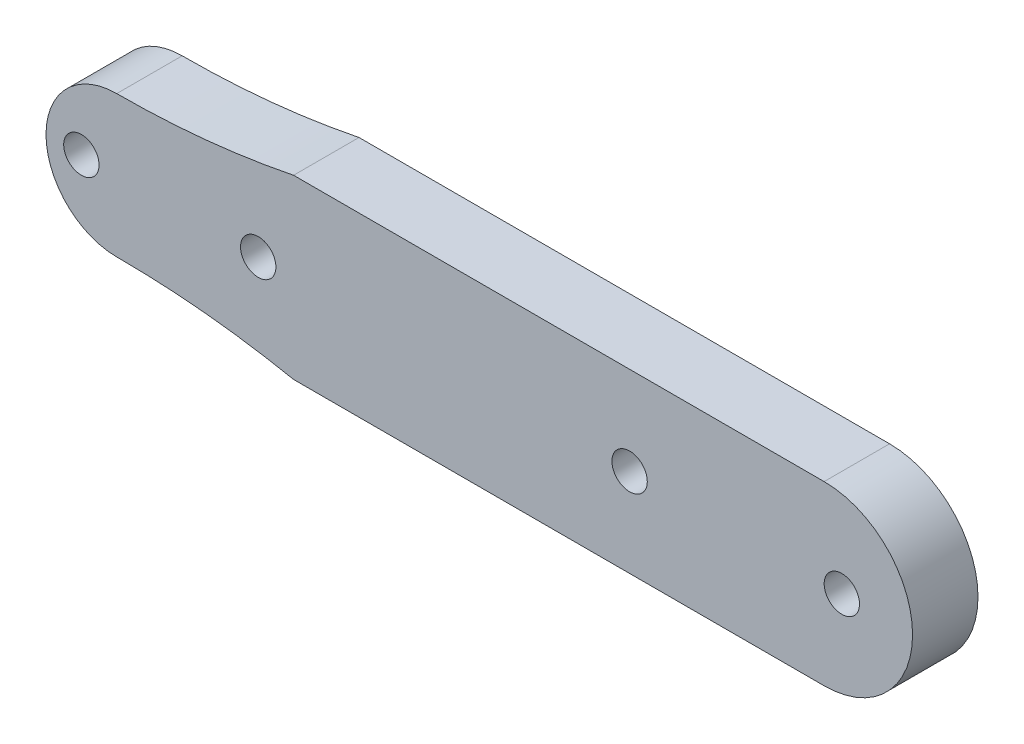
ISO-10303-21;
HEADER;
FILE_DESCRIPTION(('STEP AP214'),'2;1');
FILE_NAME('part.step','',(''),(''),'','','');
FILE_SCHEMA(('AUTOMOTIVE_DESIGN { 1 0 10303 214 1 1 1 1 }'));
ENDSEC;
DATA;
#1=APPLICATION_CONTEXT('core data for automotive mechanical design processes');
#2=APPLICATION_PROTOCOL_DEFINITION('international standard','automotive_design',2000,#1);
#3=PRODUCT_CONTEXT('',#1,'mechanical');
#4=PRODUCT('Part','Part','',(#3));
#5=PRODUCT_RELATED_PRODUCT_CATEGORY('part','',(#4));
#6=PRODUCT_DEFINITION_FORMATION('','',#4);
#7=PRODUCT_DEFINITION_CONTEXT('part definition',#1,'design');
#8=PRODUCT_DEFINITION('design','',#6,#7);
#9=PRODUCT_DEFINITION_SHAPE('','',#8);
#10=(LENGTH_UNIT() NAMED_UNIT(*) SI_UNIT(.MILLI.,.METRE.));
#11=(NAMED_UNIT(*) PLANE_ANGLE_UNIT() SI_UNIT($,.RADIAN.));
#12=(NAMED_UNIT(*) SI_UNIT($,.STERADIAN.) SOLID_ANGLE_UNIT());
#13=UNCERTAINTY_MEASURE_WITH_UNIT(LENGTH_MEASURE(1.E-05),#10,'distance_accuracy_value','');
#14=(GEOMETRIC_REPRESENTATION_CONTEXT(3) GLOBAL_UNCERTAINTY_ASSIGNED_CONTEXT((#13)) GLOBAL_UNIT_ASSIGNED_CONTEXT((#10,
#11,#12)) REPRESENTATION_CONTEXT('',''));
#15=CARTESIAN_POINT('',(0.,0.,0.));
#16=DIRECTION('',(0.,0.,1.));
#17=DIRECTION('',(1.,0.,0.));
#18=AXIS2_PLACEMENT_3D('',#15,#16,#17);
#19=CARTESIAN_POINT('',(-10.,54.5,3.7));
#20=DIRECTION('',(0.,0.,1.));
#21=DIRECTION('',(1.,0.,0.));
#22=AXIS2_PLACEMENT_3D('',#19,#20,#21);
#23=PLANE('',#22);
#24=CARTESIAN_POINT('',(19.,0.,3.7));
#25=DIRECTION('',(0.,0.,1.));
#26=DIRECTION('',(1.,0.,0.));
#27=AXIS2_PLACEMENT_3D('',#24,#25,#26);
#28=CIRCLE('',#27,1.);
#29=CARTESIAN_POINT('',(20.,0.,3.7));
#30=VERTEX_POINT('',#29);
#31=EDGE_CURVE('E188',#30,#30,#28,.T.);
#32=ORIENTED_EDGE('',*,*,#31,.F.);
#33=EDGE_LOOP('',(#32));
#34=FACE_BOUND('',#33,.T.);
#35=CARTESIAN_POINT('',(-12.,0.,3.7));
#36=DIRECTION('',(0.,0.,1.));
#37=DIRECTION('',(1.,0.,0.));
#38=AXIS2_PLACEMENT_3D('',#35,#36,#37);
#39=CIRCLE('',#38,1.);
#40=CARTESIAN_POINT('',(-11.,0.,3.7));
#41=VERTEX_POINT('',#40);
#42=EDGE_CURVE('E121',#41,#41,#39,.T.);
#43=ORIENTED_EDGE('',*,*,#42,.F.);
#44=EDGE_LOOP('',(#43));
#45=FACE_BOUND('',#44,.T.);
#46=CARTESIAN_POINT('',(-10.,54.5,3.7));
#47=DIRECTION('',(0.,0.,-1.));
#48=DIRECTION('',(1.,0.,0.));
#49=AXIS2_PLACEMENT_3D('',#46,#47,#48);
#50=CIRCLE('',#49,50.5);
#51=CARTESIAN_POINT('',(0.,5.,3.7));
#52=VERTEX_POINT('',#51);
#53=CARTESIAN_POINT('',(-10.,4.,3.7));
#54=VERTEX_POINT('',#53);
#55=EDGE_CURVE('E128',#52,#54,#50,.T.);
#56=ORIENTED_EDGE('',*,*,#55,.T.);
#57=CARTESIAN_POINT('',(-10.,0.,3.7));
#58=DIRECTION('',(0.,0.,1.));
#59=DIRECTION('',(1.,0.,0.));
#60=AXIS2_PLACEMENT_3D('',#57,#58,#59);
#61=CIRCLE('',#60,4.);
#62=CARTESIAN_POINT('',(-10.,-4.,3.7));
#63=VERTEX_POINT('',#62);
#64=EDGE_CURVE('E86',#54,#63,#61,.T.);
#65=ORIENTED_EDGE('',*,*,#64,.T.);
#66=CARTESIAN_POINT('',(-9.99999999999999,-54.5,3.7));
#67=DIRECTION('',(0.,0.,-1.));
#68=DIRECTION('',(-1.,0.,0.));
#69=AXIS2_PLACEMENT_3D('',#66,#67,#68);
#70=CIRCLE('',#69,50.5);
#71=CARTESIAN_POINT('',(0.,-5.,3.7));
#72=VERTEX_POINT('',#71);
#73=EDGE_CURVE('E99',#63,#72,#70,.T.);
#74=ORIENTED_EDGE('',*,*,#73,.T.);
#75=DIRECTION('',(1.,0.,0.));
#76=VECTOR('',#75,1.);
#77=CARTESIAN_POINT('',(0.,-5.,3.7));
#78=LINE('',#77,#76);
#79=CARTESIAN_POINT('',(30.0000000000001,-5.,3.7));
#80=VERTEX_POINT('',#79);
#81=EDGE_CURVE('E93',#72,#80,#78,.T.);
#82=ORIENTED_EDGE('',*,*,#81,.T.);
#83=CARTESIAN_POINT('',(30.,0.,3.7));
#84=DIRECTION('',(0.,0.,1.));
#85=DIRECTION('',(1.,0.,0.));
#86=AXIS2_PLACEMENT_3D('',#83,#84,#85);
#87=CIRCLE('',#86,5.);
#88=CARTESIAN_POINT('',(30.,5.00000000000011,3.7));
#89=VERTEX_POINT('',#88);
#90=EDGE_CURVE('E97',#80,#89,#87,.T.);
#91=ORIENTED_EDGE('',*,*,#90,.T.);
#92=DIRECTION('',(-1.,0.,0.));
#93=VECTOR('',#92,1.);
#94=CARTESIAN_POINT('',(0.,5.,3.7));
#95=LINE('',#94,#93);
#96=EDGE_CURVE('E49',#89,#52,#95,.T.);
#97=ORIENTED_EDGE('',*,*,#96,.T.);
#98=EDGE_LOOP('',(#56,#65,#74,#82,#91,#97));
#99=FACE_BOUND('',#98,.T.);
#100=CARTESIAN_POINT('',(-2.,0.,3.7));
#101=DIRECTION('',(0.,0.,1.));
#102=DIRECTION('',(1.,0.,0.));
#103=AXIS2_PLACEMENT_3D('',#100,#101,#102);
#104=CIRCLE('',#103,1.);
#105=CARTESIAN_POINT('',(-1.,0.,3.7));
#106=VERTEX_POINT('',#105);
#107=EDGE_CURVE('E194',#106,#106,#104,.T.);
#108=ORIENTED_EDGE('',*,*,#107,.F.);
#109=EDGE_LOOP('',(#108));
#110=FACE_BOUND('',#109,.T.);
#111=CARTESIAN_POINT('',(31.,0.,3.7));
#112=DIRECTION('',(0.,0.,1.));
#113=DIRECTION('',(1.,0.,0.));
#114=AXIS2_PLACEMENT_3D('',#111,#112,#113);
#115=CIRCLE('',#114,0.999999999999995);
#116=CARTESIAN_POINT('',(32.,0.,3.7));
#117=VERTEX_POINT('',#116);
#118=EDGE_CURVE('E179',#117,#117,#115,.T.);
#119=ORIENTED_EDGE('',*,*,#118,.F.);
#120=EDGE_LOOP('',(#119));
#121=FACE_BOUND('',#120,.T.);
#122=ADVANCED_FACE('F32',(#34,#45,#99,#110,#121),#23,.T.);
#123=CARTESIAN_POINT('',(-10.,54.5,0.));
#124=DIRECTION('',(0.,0.,1.));
#125=DIRECTION('',(1.,0.,0.));
#126=AXIS2_PLACEMENT_3D('',#123,#124,#125);
#127=PLANE('',#126);
#128=CARTESIAN_POINT('',(-10.,54.5,0.));
#129=DIRECTION('',(0.,0.,-1.));
#130=DIRECTION('',(1.,0.,0.));
#131=AXIS2_PLACEMENT_3D('',#128,#129,#130);
#132=CIRCLE('',#131,50.5);
#133=CARTESIAN_POINT('',(0.,5.,0.));
#134=VERTEX_POINT('',#133);
#135=CARTESIAN_POINT('',(-10.,4.,0.));
#136=VERTEX_POINT('',#135);
#137=EDGE_CURVE('E117',#134,#136,#132,.T.);
#138=ORIENTED_EDGE('',*,*,#137,.F.);
#139=DIRECTION('',(-1.,0.,0.));
#140=VECTOR('',#139,1.);
#141=CARTESIAN_POINT('',(0.,5.,0.));
#142=LINE('',#141,#140);
#143=CARTESIAN_POINT('',(30.,5.00000000000011,0.));
#144=VERTEX_POINT('',#143);
#145=EDGE_CURVE('E78',#144,#134,#142,.T.);
#146=ORIENTED_EDGE('',*,*,#145,.F.);
#147=CARTESIAN_POINT('',(30.,0.,0.));
#148=DIRECTION('',(0.,0.,1.));
#149=DIRECTION('',(1.,0.,0.));
#150=AXIS2_PLACEMENT_3D('',#147,#148,#149);
#151=CIRCLE('',#150,5.);
#152=CARTESIAN_POINT('',(30.0000000000001,-5.,0.));
#153=VERTEX_POINT('',#152);
#154=EDGE_CURVE('E72',#153,#144,#151,.T.);
#155=ORIENTED_EDGE('',*,*,#154,.F.);
#156=DIRECTION('',(1.,0.,0.));
#157=VECTOR('',#156,1.);
#158=CARTESIAN_POINT('',(0.,-5.,0.));
#159=LINE('',#158,#157);
#160=CARTESIAN_POINT('',(0.,-5.,0.));
#161=VERTEX_POINT('',#160);
#162=EDGE_CURVE('E107',#161,#153,#159,.T.);
#163=ORIENTED_EDGE('',*,*,#162,.F.);
#164=CARTESIAN_POINT('',(-9.99999999999999,-54.5,0.));
#165=DIRECTION('',(0.,0.,-1.));
#166=DIRECTION('',(-1.,0.,0.));
#167=AXIS2_PLACEMENT_3D('',#164,#165,#166);
#168=CIRCLE('',#167,50.5);
#169=CARTESIAN_POINT('',(-10.,-4.,0.));
#170=VERTEX_POINT('',#169);
#171=EDGE_CURVE('E123',#170,#161,#168,.T.);
#172=ORIENTED_EDGE('',*,*,#171,.F.);
#173=CARTESIAN_POINT('',(-10.,0.,0.));
#174=DIRECTION('',(0.,0.,1.));
#175=DIRECTION('',(1.,0.,0.));
#176=AXIS2_PLACEMENT_3D('',#173,#174,#175);
#177=CIRCLE('',#176,4.);
#178=EDGE_CURVE('E120',#136,#170,#177,.T.);
#179=ORIENTED_EDGE('',*,*,#178,.F.);
#180=EDGE_LOOP('',(#138,#146,#155,#163,#172,#179));
#181=FACE_BOUND('',#180,.T.);
#182=CARTESIAN_POINT('',(-12.,0.,0.));
#183=DIRECTION('',(0.,0.,1.));
#184=DIRECTION('',(1.,0.,0.));
#185=AXIS2_PLACEMENT_3D('',#182,#183,#184);
#186=CIRCLE('',#185,1.);
#187=CARTESIAN_POINT('',(-11.,0.,0.));
#188=VERTEX_POINT('',#187);
#189=EDGE_CURVE('E197',#188,#188,#186,.T.);
#190=ORIENTED_EDGE('',*,*,#189,.T.);
#191=EDGE_LOOP('',(#190));
#192=FACE_BOUND('',#191,.T.);
#193=CARTESIAN_POINT('',(-2.,0.,0.));
#194=DIRECTION('',(0.,0.,1.));
#195=DIRECTION('',(1.,0.,0.));
#196=AXIS2_PLACEMENT_3D('',#193,#194,#195);
#197=CIRCLE('',#196,1.);
#198=CARTESIAN_POINT('',(-1.,0.,0.));
#199=VERTEX_POINT('',#198);
#200=EDGE_CURVE('E191',#199,#199,#197,.T.);
#201=ORIENTED_EDGE('',*,*,#200,.T.);
#202=EDGE_LOOP('',(#201));
#203=FACE_BOUND('',#202,.T.);
#204=CARTESIAN_POINT('',(19.,0.,0.));
#205=DIRECTION('',(0.,0.,1.));
#206=DIRECTION('',(1.,0.,0.));
#207=AXIS2_PLACEMENT_3D('',#204,#205,#206);
#208=CIRCLE('',#207,1.);
#209=CARTESIAN_POINT('',(20.,0.,0.));
#210=VERTEX_POINT('',#209);
#211=EDGE_CURVE('E185',#210,#210,#208,.T.);
#212=ORIENTED_EDGE('',*,*,#211,.T.);
#213=EDGE_LOOP('',(#212));
#214=FACE_BOUND('',#213,.T.);
#215=CARTESIAN_POINT('',(31.,0.,0.));
#216=DIRECTION('',(0.,0.,1.));
#217=DIRECTION('',(1.,0.,0.));
#218=AXIS2_PLACEMENT_3D('',#215,#216,#217);
#219=CIRCLE('',#218,0.999999999999995);
#220=CARTESIAN_POINT('',(32.,0.,0.));
#221=VERTEX_POINT('',#220);
#222=EDGE_CURVE('E182',#221,#221,#219,.T.);
#223=ORIENTED_EDGE('',*,*,#222,.T.);
#224=EDGE_LOOP('',(#223));
#225=FACE_BOUND('',#224,.T.);
#226=ADVANCED_FACE('F137',(#181,#192,#203,#214,#225),#127,.F.);
#227=CARTESIAN_POINT('',(-10.,54.5,3.7));
#228=DIRECTION('',(0.,0.,-1.));
#229=DIRECTION('',(-1.,0.,0.));
#230=AXIS2_PLACEMENT_3D('',#227,#228,#229);
#231=CYLINDRICAL_SURFACE('',#230,50.5);
#232=ORIENTED_EDGE('',*,*,#137,.T.);
#233=DIRECTION('',(0.,0.,-1.));
#234=VECTOR('',#233,1.);
#235=CARTESIAN_POINT('',(-10.,4.,3.7));
#236=LINE('',#235,#234);
#237=EDGE_CURVE('E11',#54,#136,#236,.T.);
#238=ORIENTED_EDGE('',*,*,#237,.F.);
#239=ORIENTED_EDGE('',*,*,#55,.F.);
#240=DIRECTION('',(0.,0.,-1.));
#241=VECTOR('',#240,1.);
#242=CARTESIAN_POINT('',(0.,5.,3.7));
#243=LINE('',#242,#241);
#244=EDGE_CURVE('E113',#52,#134,#243,.T.);
#245=ORIENTED_EDGE('',*,*,#244,.T.);
#246=EDGE_LOOP('',(#232,#238,#239,#245));
#247=FACE_BOUND('',#246,.T.);
#248=ADVANCED_FACE('F34',(#247),#231,.F.);
#249=CARTESIAN_POINT('',(-10.,0.,3.7));
#250=DIRECTION('',(0.,0.,-1.));
#251=DIRECTION('',(-1.,0.,0.));
#252=AXIS2_PLACEMENT_3D('',#249,#250,#251);
#253=CYLINDRICAL_SURFACE('',#252,4.);
#254=ORIENTED_EDGE('',*,*,#178,.T.);
#255=DIRECTION('',(0.,0.,-1.));
#256=VECTOR('',#255,1.);
#257=CARTESIAN_POINT('',(-10.,-4.,3.7));
#258=LINE('',#257,#256);
#259=EDGE_CURVE('E41',#63,#170,#258,.T.);
#260=ORIENTED_EDGE('',*,*,#259,.F.);
#261=ORIENTED_EDGE('',*,*,#64,.F.);
#262=ORIENTED_EDGE('',*,*,#237,.T.);
#263=EDGE_LOOP('',(#254,#260,#261,#262));
#264=FACE_BOUND('',#263,.T.);
#265=ADVANCED_FACE('F255',(#264),#253,.T.);
#266=CARTESIAN_POINT('',(-9.99999999999999,-54.5,3.7));
#267=DIRECTION('',(0.,0.,-1.));
#268=DIRECTION('',(-1.,0.,0.));
#269=AXIS2_PLACEMENT_3D('',#266,#267,#268);
#270=CYLINDRICAL_SURFACE('',#269,50.5);
#271=ORIENTED_EDGE('',*,*,#171,.T.);
#272=DIRECTION('',(0.,0.,-1.));
#273=VECTOR('',#272,1.);
#274=CARTESIAN_POINT('',(0.,-5.,3.7));
#275=LINE('',#274,#273);
#276=EDGE_CURVE('E108',#72,#161,#275,.T.);
#277=ORIENTED_EDGE('',*,*,#276,.F.);
#278=ORIENTED_EDGE('',*,*,#73,.F.);
#279=ORIENTED_EDGE('',*,*,#259,.T.);
#280=EDGE_LOOP('',(#271,#277,#278,#279));
#281=FACE_BOUND('',#280,.T.);
#282=ADVANCED_FACE('F134',(#281),#270,.F.);
#283=CARTESIAN_POINT('',(0.,-5.,3.7));
#284=DIRECTION('',(0.,1.,0.));
#285=DIRECTION('',(-1.,0.,0.));
#286=AXIS2_PLACEMENT_3D('',#283,#284,#285);
#287=PLANE('',#286);
#288=ORIENTED_EDGE('',*,*,#162,.T.);
#289=DIRECTION('',(0.,0.,-1.));
#290=VECTOR('',#289,1.);
#291=CARTESIAN_POINT('',(30.0000000000001,-5.,3.7));
#292=LINE('',#291,#290);
#293=EDGE_CURVE('E104',#80,#153,#292,.T.);
#294=ORIENTED_EDGE('',*,*,#293,.F.);
#295=ORIENTED_EDGE('',*,*,#81,.F.);
#296=ORIENTED_EDGE('',*,*,#276,.T.);
#297=EDGE_LOOP('',(#288,#294,#295,#296));
#298=FACE_BOUND('',#297,.T.);
#299=ADVANCED_FACE('F105',(#298),#287,.F.);
#300=CARTESIAN_POINT('',(30.,0.,3.7));
#301=DIRECTION('',(0.,0.,-1.));
#302=DIRECTION('',(-1.,0.,0.));
#303=AXIS2_PLACEMENT_3D('',#300,#301,#302);
#304=CYLINDRICAL_SURFACE('',#303,5.);
#305=ORIENTED_EDGE('',*,*,#154,.T.);
#306=DIRECTION('',(0.,0.,-1.));
#307=VECTOR('',#306,1.);
#308=CARTESIAN_POINT('',(30.,5.00000000000011,3.7));
#309=LINE('',#308,#307);
#310=EDGE_CURVE('E109',#89,#144,#309,.T.);
#311=ORIENTED_EDGE('',*,*,#310,.F.);
#312=ORIENTED_EDGE('',*,*,#90,.F.);
#313=ORIENTED_EDGE('',*,*,#293,.T.);
#314=EDGE_LOOP('',(#305,#311,#312,#313));
#315=FACE_BOUND('',#314,.T.);
#316=ADVANCED_FACE('F111',(#315),#304,.T.);
#317=CARTESIAN_POINT('',(0.,5.,3.7));
#318=DIRECTION('',(0.,-1.,0.));
#319=DIRECTION('',(1.,0.,0.));
#320=AXIS2_PLACEMENT_3D('',#317,#318,#319);
#321=PLANE('',#320);
#322=ORIENTED_EDGE('',*,*,#145,.T.);
#323=ORIENTED_EDGE('',*,*,#244,.F.);
#324=ORIENTED_EDGE('',*,*,#96,.F.);
#325=ORIENTED_EDGE('',*,*,#310,.T.);
#326=EDGE_LOOP('',(#322,#323,#324,#325));
#327=FACE_BOUND('',#326,.T.);
#328=ADVANCED_FACE('F142',(#327),#321,.F.);
#329=CARTESIAN_POINT('',(-12.,0.,3.7));
#330=DIRECTION('',(0.,0.,-1.));
#331=DIRECTION('',(-1.,0.,0.));
#332=AXIS2_PLACEMENT_3D('',#329,#330,#331);
#333=CYLINDRICAL_SURFACE('',#332,1.);
#334=ORIENTED_EDGE('',*,*,#42,.T.);
#335=EDGE_LOOP('',(#334));
#336=FACE_BOUND('',#335,.T.);
#337=ORIENTED_EDGE('',*,*,#189,.F.);
#338=EDGE_LOOP('',(#337));
#339=FACE_BOUND('',#338,.T.);
#340=ADVANCED_FACE('F144',(#336,#339),#333,.F.);
#341=CARTESIAN_POINT('',(-2.,0.,3.7));
#342=DIRECTION('',(0.,0.,-1.));
#343=DIRECTION('',(-1.,0.,0.));
#344=AXIS2_PLACEMENT_3D('',#341,#342,#343);
#345=CYLINDRICAL_SURFACE('',#344,1.);
#346=ORIENTED_EDGE('',*,*,#107,.T.);
#347=EDGE_LOOP('',(#346));
#348=FACE_BOUND('',#347,.T.);
#349=ORIENTED_EDGE('',*,*,#200,.F.);
#350=EDGE_LOOP('',(#349));
#351=FACE_BOUND('',#350,.T.);
#352=ADVANCED_FACE('F150',(#348,#351),#345,.F.);
#353=CARTESIAN_POINT('',(19.,0.,3.7));
#354=DIRECTION('',(0.,0.,-1.));
#355=DIRECTION('',(-1.,0.,0.));
#356=AXIS2_PLACEMENT_3D('',#353,#354,#355);
#357=CYLINDRICAL_SURFACE('',#356,1.);
#358=ORIENTED_EDGE('',*,*,#31,.T.);
#359=EDGE_LOOP('',(#358));
#360=FACE_BOUND('',#359,.T.);
#361=ORIENTED_EDGE('',*,*,#211,.F.);
#362=EDGE_LOOP('',(#361));
#363=FACE_BOUND('',#362,.T.);
#364=ADVANCED_FACE('F166',(#360,#363),#357,.F.);
#365=CARTESIAN_POINT('',(31.,0.,3.7));
#366=DIRECTION('',(0.,0.,-1.));
#367=DIRECTION('',(-1.,0.,0.));
#368=AXIS2_PLACEMENT_3D('',#365,#366,#367);
#369=CYLINDRICAL_SURFACE('',#368,0.999999999999995);
#370=ORIENTED_EDGE('',*,*,#118,.T.);
#371=EDGE_LOOP('',(#370));
#372=FACE_BOUND('',#371,.T.);
#373=ORIENTED_EDGE('',*,*,#222,.F.);
#374=EDGE_LOOP('',(#373));
#375=FACE_BOUND('',#374,.T.);
#376=ADVANCED_FACE('F170',(#372,#375),#369,.F.);
#377=CLOSED_SHELL('',(#122,#226,#248,#265,#282,#299,#316,#328,#340,#352,#364,#376));
#378=MANIFOLD_SOLID_BREP('B2',#377);
#379=ADVANCED_BREP_SHAPE_REPRESENTATION('',(#18,#378),#14);
#380=SHAPE_DEFINITION_REPRESENTATION(#9,#379);
ENDSEC;
END-ISO-10303-21;
